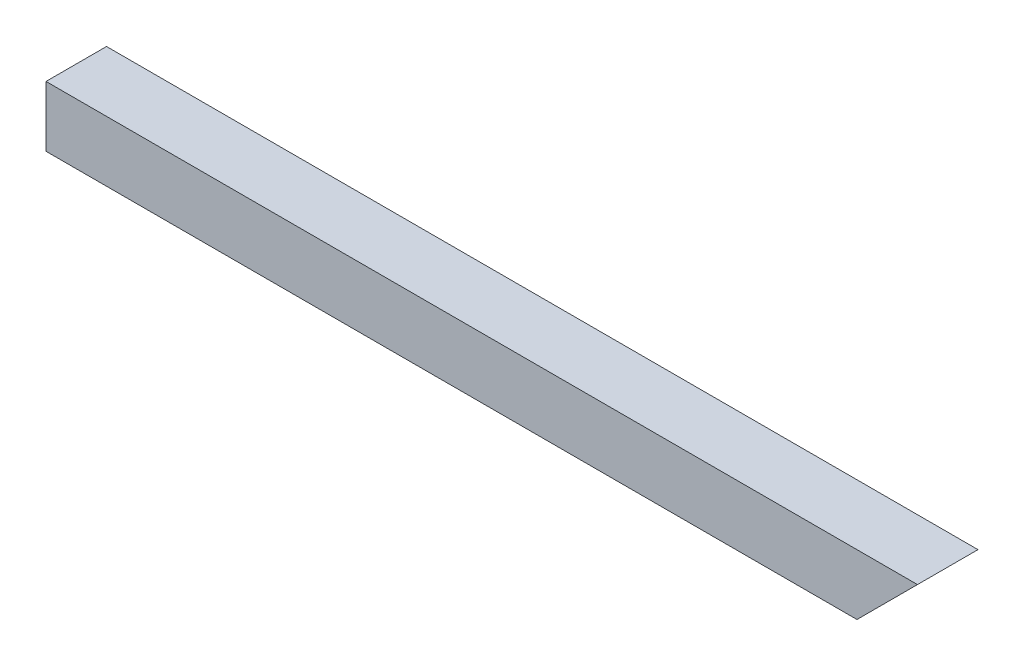
ISO-10303-21;
HEADER;
FILE_DESCRIPTION(('STEP AP214'),'2;1');
FILE_NAME('part.step','',(''),(''),'','','');
FILE_SCHEMA(('AUTOMOTIVE_DESIGN { 1 0 10303 214 1 1 1 1 }'));
ENDSEC;
DATA;
#1=APPLICATION_CONTEXT('core data for automotive mechanical design processes');
#2=APPLICATION_PROTOCOL_DEFINITION('international standard','automotive_design',2000,#1);
#3=PRODUCT_CONTEXT('',#1,'mechanical');
#4=PRODUCT('Part','Part','',(#3));
#5=PRODUCT_RELATED_PRODUCT_CATEGORY('part','',(#4));
#6=PRODUCT_DEFINITION_FORMATION('','',#4);
#7=PRODUCT_DEFINITION_CONTEXT('part definition',#1,'design');
#8=PRODUCT_DEFINITION('design','',#6,#7);
#9=PRODUCT_DEFINITION_SHAPE('','',#8);
#10=(LENGTH_UNIT() NAMED_UNIT(*) SI_UNIT(.MILLI.,.METRE.));
#11=(NAMED_UNIT(*) PLANE_ANGLE_UNIT() SI_UNIT($,.RADIAN.));
#12=(NAMED_UNIT(*) SI_UNIT($,.STERADIAN.) SOLID_ANGLE_UNIT());
#13=UNCERTAINTY_MEASURE_WITH_UNIT(LENGTH_MEASURE(1.E-05),#10,'distance_accuracy_value','');
#14=(GEOMETRIC_REPRESENTATION_CONTEXT(3) GLOBAL_UNCERTAINTY_ASSIGNED_CONTEXT((#13)) GLOBAL_UNIT_ASSIGNED_CONTEXT((#10,
#11,#12)) REPRESENTATION_CONTEXT('',''));
#15=CARTESIAN_POINT('',(0.,0.,0.));
#16=DIRECTION('',(0.,0.,1.));
#17=DIRECTION('',(1.,0.,0.));
#18=AXIS2_PLACEMENT_3D('',#15,#16,#17);
#19=CARTESIAN_POINT('',(0.,0.,0.));
#20=DIRECTION('',(1.,0.,0.));
#21=DIRECTION('',(0.,0.,-1.));
#22=AXIS2_PLACEMENT_3D('',#19,#20,#21);
#23=PLANE('',#22);
#24=DIRECTION('',(0.,-1.,0.));
#25=VECTOR('',#24,1.);
#26=CARTESIAN_POINT('',(0.,-12.5,12.5));
#27=LINE('',#26,#25);
#28=CARTESIAN_POINT('',(0.,12.5,12.5));
#29=VERTEX_POINT('',#28);
#30=CARTESIAN_POINT('',(0.,-12.5,12.5));
#31=VERTEX_POINT('',#30);
#32=EDGE_CURVE('E142',#29,#31,#27,.T.);
#33=ORIENTED_EDGE('',*,*,#32,.F.);
#34=DIRECTION('',(0.,0.,1.));
#35=VECTOR('',#34,1.);
#36=CARTESIAN_POINT('',(0.,12.5,-12.5));
#37=LINE('',#36,#35);
#38=CARTESIAN_POINT('',(0.,12.5,-12.5));
#39=VERTEX_POINT('',#38);
#40=EDGE_CURVE('E115',#39,#29,#37,.T.);
#41=ORIENTED_EDGE('',*,*,#40,.F.);
#42=DIRECTION('',(0.,1.,0.));
#43=VECTOR('',#42,1.);
#44=CARTESIAN_POINT('',(0.,-12.5,-12.5));
#45=LINE('',#44,#43);
#46=CARTESIAN_POINT('',(0.,-12.5,-12.5));
#47=VERTEX_POINT('',#46);
#48=EDGE_CURVE('E143',#47,#39,#45,.T.);
#49=ORIENTED_EDGE('',*,*,#48,.F.);
#50=DIRECTION('',(0.,0.,-1.));
#51=VECTOR('',#50,1.);
#52=CARTESIAN_POINT('',(0.,-12.5,-12.5));
#53=LINE('',#52,#51);
#54=EDGE_CURVE('E138',#31,#47,#53,.T.);
#55=ORIENTED_EDGE('',*,*,#54,.F.);
#56=EDGE_LOOP('',(#33,#41,#49,#55));
#57=FACE_BOUND('',#56,.T.);
#58=DIRECTION('',(0.,-1.,0.));
#59=VECTOR('',#58,1.);
#60=CARTESIAN_POINT('',(0.,-11.5,11.5));
#61=LINE('',#60,#59);
#62=CARTESIAN_POINT('',(0.,11.5,11.5));
#63=VERTEX_POINT('',#62);
#64=CARTESIAN_POINT('',(0.,-11.5,11.5));
#65=VERTEX_POINT('',#64);
#66=EDGE_CURVE('E151',#63,#65,#61,.T.);
#67=ORIENTED_EDGE('',*,*,#66,.T.);
#68=DIRECTION('',(0.,0.,-1.));
#69=VECTOR('',#68,1.);
#70=CARTESIAN_POINT('',(0.,-11.5,-11.5));
#71=LINE('',#70,#69);
#72=CARTESIAN_POINT('',(0.,-11.5,-11.5));
#73=VERTEX_POINT('',#72);
#74=EDGE_CURVE('E154',#65,#73,#71,.T.);
#75=ORIENTED_EDGE('',*,*,#74,.T.);
#76=DIRECTION('',(0.,1.,0.));
#77=VECTOR('',#76,1.);
#78=CARTESIAN_POINT('',(0.,-11.5,-11.5));
#79=LINE('',#78,#77);
#80=CARTESIAN_POINT('',(0.,11.5,-11.5));
#81=VERTEX_POINT('',#80);
#82=EDGE_CURVE('E162',#73,#81,#79,.T.);
#83=ORIENTED_EDGE('',*,*,#82,.T.);
#84=DIRECTION('',(0.,0.,1.));
#85=VECTOR('',#84,1.);
#86=CARTESIAN_POINT('',(0.,11.5,-11.5));
#87=LINE('',#86,#85);
#88=EDGE_CURVE('E165',#81,#63,#87,.T.);
#89=ORIENTED_EDGE('',*,*,#88,.T.);
#90=EDGE_LOOP('',(#67,#75,#83,#89));
#91=FACE_BOUND('',#90,.T.);
#92=ADVANCED_FACE('F39',(#57,#91),#23,.F.);
#93=CARTESIAN_POINT('',(360.,-12.5,12.5));
#94=DIRECTION('',(0.,0.,-1.));
#95=DIRECTION('',(-1.,0.,0.));
#96=AXIS2_PLACEMENT_3D('',#93,#94,#95);
#97=PLANE('',#96);
#98=DIRECTION('',(-1.,0.,0.));
#99=VECTOR('',#98,1.);
#100=CARTESIAN_POINT('',(360.,-12.5,12.5));
#101=LINE('',#100,#99);
#102=CARTESIAN_POINT('',(335.,-12.5,12.5));
#103=VERTEX_POINT('',#102);
#104=EDGE_CURVE('E47',#103,#31,#101,.T.);
#105=ORIENTED_EDGE('',*,*,#104,.F.);
#106=DIRECTION('',(-0.707106781186551,-0.707106781186544,0.));
#107=VECTOR('',#106,1.);
#108=CARTESIAN_POINT('',(360.,12.5,12.5));
#109=LINE('',#108,#107);
#110=CARTESIAN_POINT('',(360.,12.5,12.5));
#111=VERTEX_POINT('',#110);
#112=EDGE_CURVE('E106',#111,#103,#109,.T.);
#113=ORIENTED_EDGE('',*,*,#112,.F.);
#114=DIRECTION('',(-1.,0.,0.));
#115=VECTOR('',#114,1.);
#116=CARTESIAN_POINT('',(360.,12.5,12.5));
#117=LINE('',#116,#115);
#118=EDGE_CURVE('E114',#111,#29,#117,.T.);
#119=ORIENTED_EDGE('',*,*,#118,.T.);
#120=ORIENTED_EDGE('',*,*,#32,.T.);
#121=EDGE_LOOP('',(#105,#113,#119,#120));
#122=FACE_BOUND('',#121,.T.);
#123=ADVANCED_FACE('F41',(#122),#97,.F.);
#124=CARTESIAN_POINT('',(360.,-12.5,-12.5));
#125=DIRECTION('',(0.,1.,0.));
#126=DIRECTION('',(0.,0.,1.));
#127=AXIS2_PLACEMENT_3D('',#124,#125,#126);
#128=PLANE('',#127);
#129=DIRECTION('',(-1.,0.,0.));
#130=VECTOR('',#129,1.);
#131=CARTESIAN_POINT('',(360.,-12.5,-12.5));
#132=LINE('',#131,#130);
#133=CARTESIAN_POINT('',(335.,-12.5,-12.5000000000001));
#134=VERTEX_POINT('',#133);
#135=EDGE_CURVE('E128',#134,#47,#132,.T.);
#136=ORIENTED_EDGE('',*,*,#135,.F.);
#137=DIRECTION('',(0.,0.,1.));
#138=VECTOR('',#137,1.);
#139=CARTESIAN_POINT('',(335.,-12.5,-347.5));
#140=LINE('',#139,#138);
#141=EDGE_CURVE('E122',#134,#103,#140,.T.);
#142=ORIENTED_EDGE('',*,*,#141,.T.);
#143=ORIENTED_EDGE('',*,*,#104,.T.);
#144=ORIENTED_EDGE('',*,*,#54,.T.);
#145=EDGE_LOOP('',(#136,#142,#143,#144));
#146=FACE_BOUND('',#145,.T.);
#147=ADVANCED_FACE('F137',(#146),#128,.F.);
#148=CARTESIAN_POINT('',(360.,-12.5,-12.5));
#149=DIRECTION('',(0.,0.,1.));
#150=DIRECTION('',(1.,0.,0.));
#151=AXIS2_PLACEMENT_3D('',#148,#149,#150);
#152=PLANE('',#151);
#153=DIRECTION('',(-1.,0.,0.));
#154=VECTOR('',#153,1.);
#155=CARTESIAN_POINT('',(360.,12.5,-12.5));
#156=LINE('',#155,#154);
#157=CARTESIAN_POINT('',(360.,12.5,-12.5));
#158=VERTEX_POINT('',#157);
#159=EDGE_CURVE('E126',#158,#39,#156,.T.);
#160=ORIENTED_EDGE('',*,*,#159,.F.);
#161=DIRECTION('',(-0.707106781186551,-0.707106781186544,0.));
#162=VECTOR('',#161,1.);
#163=CARTESIAN_POINT('',(347.5,1.21430643318376E-13,-12.5));
#164=LINE('',#163,#162);
#165=EDGE_CURVE('E109',#158,#134,#164,.T.);
#166=ORIENTED_EDGE('',*,*,#165,.T.);
#167=ORIENTED_EDGE('',*,*,#135,.T.);
#168=ORIENTED_EDGE('',*,*,#48,.T.);
#169=EDGE_LOOP('',(#160,#166,#167,#168));
#170=FACE_BOUND('',#169,.T.);
#171=ADVANCED_FACE('F150',(#170),#152,.F.);
#172=CARTESIAN_POINT('',(360.,12.5,-12.5));
#173=DIRECTION('',(0.,-1.,0.));
#174=DIRECTION('',(0.,0.,-1.));
#175=AXIS2_PLACEMENT_3D('',#172,#173,#174);
#176=PLANE('',#175);
#177=ORIENTED_EDGE('',*,*,#40,.T.);
#178=ORIENTED_EDGE('',*,*,#118,.F.);
#179=DIRECTION('',(0.,0.,1.));
#180=VECTOR('',#179,1.);
#181=CARTESIAN_POINT('',(360.,12.5,-12.5));
#182=LINE('',#181,#180);
#183=EDGE_CURVE('E103',#158,#111,#182,.T.);
#184=ORIENTED_EDGE('',*,*,#183,.F.);
#185=ORIENTED_EDGE('',*,*,#159,.T.);
#186=EDGE_LOOP('',(#177,#178,#184,#185));
#187=FACE_BOUND('',#186,.T.);
#188=ADVANCED_FACE('F124',(#187),#176,.F.);
#189=CARTESIAN_POINT('',(360.,-11.5,11.5));
#190=DIRECTION('',(0.,0.,-1.));
#191=DIRECTION('',(-1.,0.,0.));
#192=AXIS2_PLACEMENT_3D('',#189,#190,#191);
#193=PLANE('',#192);
#194=DIRECTION('',(0.707106781186551,0.707106781186544,0.));
#195=VECTOR('',#194,1.);
#196=CARTESIAN_POINT('',(348.,0.500000000000118,11.5));
#197=LINE('',#196,#195);
#198=CARTESIAN_POINT('',(336.,-11.5,11.5));
#199=VERTEX_POINT('',#198);
#200=CARTESIAN_POINT('',(359.,11.5,11.5));
#201=VERTEX_POINT('',#200);
#202=EDGE_CURVE('E53',#199,#201,#197,.T.);
#203=ORIENTED_EDGE('',*,*,#202,.F.);
#204=DIRECTION('',(-1.,0.,0.));
#205=VECTOR('',#204,1.);
#206=CARTESIAN_POINT('',(360.,-11.5,11.5));
#207=LINE('',#206,#205);
#208=EDGE_CURVE('E145',#199,#65,#207,.T.);
#209=ORIENTED_EDGE('',*,*,#208,.T.);
#210=ORIENTED_EDGE('',*,*,#66,.F.);
#211=DIRECTION('',(-1.,0.,0.));
#212=VECTOR('',#211,1.);
#213=CARTESIAN_POINT('',(360.,11.5,11.5));
#214=LINE('',#213,#212);
#215=EDGE_CURVE('E60',#201,#63,#214,.T.);
#216=ORIENTED_EDGE('',*,*,#215,.F.);
#217=EDGE_LOOP('',(#203,#209,#210,#216));
#218=FACE_BOUND('',#217,.T.);
#219=ADVANCED_FACE('F183',(#218),#193,.T.);
#220=CARTESIAN_POINT('',(360.,-11.5,-11.5));
#221=DIRECTION('',(0.,1.,0.));
#222=DIRECTION('',(0.,0.,1.));
#223=AXIS2_PLACEMENT_3D('',#220,#221,#222);
#224=PLANE('',#223);
#225=DIRECTION('',(0.,0.,1.));
#226=VECTOR('',#225,1.);
#227=CARTESIAN_POINT('',(336.,-11.5,-11.5));
#228=LINE('',#227,#226);
#229=CARTESIAN_POINT('',(336.,-11.5,-11.5));
#230=VERTEX_POINT('',#229);
#231=EDGE_CURVE('E156',#230,#199,#228,.T.);
#232=ORIENTED_EDGE('',*,*,#231,.F.);
#233=DIRECTION('',(-1.,0.,0.));
#234=VECTOR('',#233,1.);
#235=CARTESIAN_POINT('',(360.,-11.5,-11.5));
#236=LINE('',#235,#234);
#237=EDGE_CURVE('E147',#230,#73,#236,.T.);
#238=ORIENTED_EDGE('',*,*,#237,.T.);
#239=ORIENTED_EDGE('',*,*,#74,.F.);
#240=ORIENTED_EDGE('',*,*,#208,.F.);
#241=EDGE_LOOP('',(#232,#238,#239,#240));
#242=FACE_BOUND('',#241,.T.);
#243=ADVANCED_FACE('F176',(#242),#224,.T.);
#244=CARTESIAN_POINT('',(360.,-11.5,-11.5));
#245=DIRECTION('',(0.,0.,1.));
#246=DIRECTION('',(1.,0.,0.));
#247=AXIS2_PLACEMENT_3D('',#244,#245,#246);
#248=PLANE('',#247);
#249=DIRECTION('',(-0.707106781186551,-0.707106781186544,0.));
#250=VECTOR('',#249,1.);
#251=CARTESIAN_POINT('',(348.,0.500000000000118,-11.5));
#252=LINE('',#251,#250);
#253=CARTESIAN_POINT('',(359.,11.5,-11.5));
#254=VERTEX_POINT('',#253);
#255=EDGE_CURVE('E253',#254,#230,#252,.T.);
#256=ORIENTED_EDGE('',*,*,#255,.F.);
#257=DIRECTION('',(-1.,0.,0.));
#258=VECTOR('',#257,1.);
#259=CARTESIAN_POINT('',(360.,11.5,-11.5));
#260=LINE('',#259,#258);
#261=EDGE_CURVE('E169',#254,#81,#260,.T.);
#262=ORIENTED_EDGE('',*,*,#261,.T.);
#263=ORIENTED_EDGE('',*,*,#82,.F.);
#264=ORIENTED_EDGE('',*,*,#237,.F.);
#265=EDGE_LOOP('',(#256,#262,#263,#264));
#266=FACE_BOUND('',#265,.T.);
#267=ADVANCED_FACE('F180',(#266),#248,.T.);
#268=CARTESIAN_POINT('',(360.,11.5,-11.5));
#269=DIRECTION('',(0.,-1.,0.));
#270=DIRECTION('',(0.,0.,-1.));
#271=AXIS2_PLACEMENT_3D('',#268,#269,#270);
#272=PLANE('',#271);
#273=DIRECTION('',(0.,0.,-1.));
#274=VECTOR('',#273,1.);
#275=CARTESIAN_POINT('',(359.,11.5,-11.5));
#276=LINE('',#275,#274);
#277=EDGE_CURVE('E11',#201,#254,#276,.T.);
#278=ORIENTED_EDGE('',*,*,#277,.F.);
#279=ORIENTED_EDGE('',*,*,#215,.T.);
#280=ORIENTED_EDGE('',*,*,#88,.F.);
#281=ORIENTED_EDGE('',*,*,#261,.F.);
#282=EDGE_LOOP('',(#278,#279,#280,#281));
#283=FACE_BOUND('',#282,.T.);
#284=ADVANCED_FACE('F234',(#283),#272,.T.);
#285=CARTESIAN_POINT('',(360.,12.5,-347.5));
#286=DIRECTION('',(-0.707106781186544,0.707106781186551,0.));
#287=DIRECTION('',(-0.707106781186551,-0.707106781186544,0.));
#288=AXIS2_PLACEMENT_3D('',#285,#286,#287);
#289=PLANE('',#288);
#290=ORIENTED_EDGE('',*,*,#202,.T.);
#291=ORIENTED_EDGE('',*,*,#277,.T.);
#292=ORIENTED_EDGE('',*,*,#255,.T.);
#293=ORIENTED_EDGE('',*,*,#231,.T.);
#294=EDGE_LOOP('',(#290,#291,#292,#293));
#295=FACE_BOUND('',#294,.T.);
#296=ORIENTED_EDGE('',*,*,#183,.T.);
#297=ORIENTED_EDGE('',*,*,#112,.T.);
#298=ORIENTED_EDGE('',*,*,#141,.F.);
#299=ORIENTED_EDGE('',*,*,#165,.F.);
#300=EDGE_LOOP('',(#296,#297,#298,#299));
#301=FACE_BOUND('',#300,.T.);
#302=ADVANCED_FACE('F105',(#295,#301),#289,.F.);
#303=CLOSED_SHELL('',(#92,#123,#147,#171,#188,#219,#243,#267,#284,#302));
#304=MANIFOLD_SOLID_BREP('B2',#303);
#305=ADVANCED_BREP_SHAPE_REPRESENTATION('',(#18,#304),#14);
#306=SHAPE_DEFINITION_REPRESENTATION(#9,#305);
ENDSEC;
END-ISO-10303-21;
